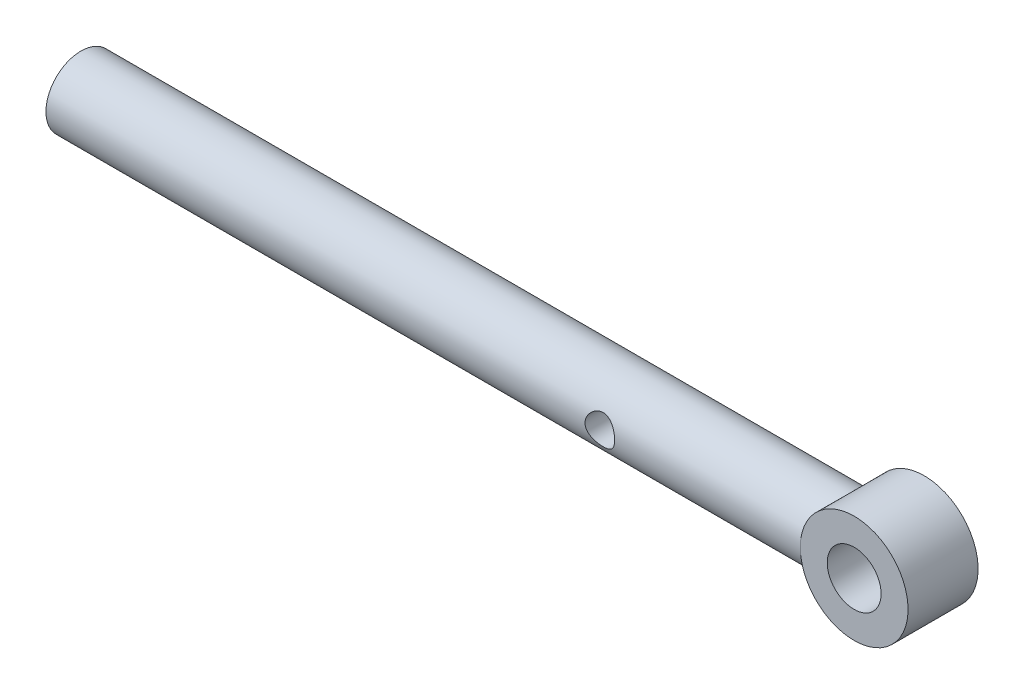
ISO-10303-21;
HEADER;
FILE_DESCRIPTION(('STEP AP214'),'2;1');
FILE_NAME('part.step','',(''),(''),'','','');
FILE_SCHEMA(('AUTOMOTIVE_DESIGN { 1 0 10303 214 1 1 1 1 }'));
ENDSEC;
DATA;
#1=APPLICATION_CONTEXT('core data for automotive mechanical design processes');
#2=APPLICATION_PROTOCOL_DEFINITION('international standard','automotive_design',2000,#1);
#3=PRODUCT_CONTEXT('',#1,'mechanical');
#4=PRODUCT('Part','Part','',(#3));
#5=PRODUCT_RELATED_PRODUCT_CATEGORY('part','',(#4));
#6=PRODUCT_DEFINITION_FORMATION('','',#4);
#7=PRODUCT_DEFINITION_CONTEXT('part definition',#1,'design');
#8=PRODUCT_DEFINITION('design','',#6,#7);
#9=PRODUCT_DEFINITION_SHAPE('','',#8);
#10=(LENGTH_UNIT() NAMED_UNIT(*) SI_UNIT(.MILLI.,.METRE.));
#11=(NAMED_UNIT(*) PLANE_ANGLE_UNIT() SI_UNIT($,.RADIAN.));
#12=(NAMED_UNIT(*) SI_UNIT($,.STERADIAN.) SOLID_ANGLE_UNIT());
#13=UNCERTAINTY_MEASURE_WITH_UNIT(LENGTH_MEASURE(1.E-05),#10,'distance_accuracy_value','');
#14=(GEOMETRIC_REPRESENTATION_CONTEXT(3) GLOBAL_UNCERTAINTY_ASSIGNED_CONTEXT((#13)) GLOBAL_UNIT_ASSIGNED_CONTEXT((#10,
#11,#12)) REPRESENTATION_CONTEXT('',''));
#15=CARTESIAN_POINT('',(0.,0.,0.));
#16=DIRECTION('',(0.,0.,1.));
#17=DIRECTION('',(1.,0.,0.));
#18=AXIS2_PLACEMENT_3D('',#15,#16,#17);
#19=CARTESIAN_POINT('',(400.,0.,0.));
#20=DIRECTION('',(-1.,0.,0.));
#21=DIRECTION('',(0.,0.,1.));
#22=AXIS2_PLACEMENT_3D('',#19,#20,#21);
#23=CYLINDRICAL_SURFACE('',#22,6.5);
#24=CARTESIAN_POINT('',(390.,0.,6.5));
#25=CARTESIAN_POINT('',(389.999993586303,0.164119280759625,6.50000685430514));
#26=CARTESIAN_POINT('',(390.004045520485,0.328181084996379,6.4937804695745));
#27=CARTESIAN_POINT('',(390.020136386316,0.655023622368724,6.46898576666347));
#28=CARTESIAN_POINT('',(390.032176420075,0.817804175595379,6.45041574544525));
#29=CARTESIAN_POINT('',(390.063961115275,1.14083286503593,6.40118886176247));
#30=CARTESIAN_POINT('',(390.083709637089,1.3010796904681,6.37052594315651));
#31=CARTESIAN_POINT('',(390.130444457707,1.61787591423726,6.29753224205717));
#32=CARTESIAN_POINT('',(390.157433744039,1.7744237573047,6.25519664323323));
#33=CARTESIAN_POINT('',(390.217878294193,2.0819505926509,6.15964840684597));
#34=CARTESIAN_POINT('',(390.251299158941,2.23295433687693,6.10649355213575));
#35=CARTESIAN_POINT('',(390.323987183279,2.52945044906857,5.98976622841122));
#36=CARTESIAN_POINT('',(390.363256609614,2.67494065258442,5.92618971927556));
#37=CARTESIAN_POINT('',(390.488656877421,3.10195683996531,5.72079421747863));
#38=CARTESIAN_POINT('',(390.582436912604,3.3743083610705,5.56422093465473));
#39=CARTESIAN_POINT('',(390.791870968579,3.91157881466344,5.20223393268196));
#40=CARTESIAN_POINT('',(390.908694067025,4.17400805136777,4.99384658437885));
#41=CARTESIAN_POINT('',(391.149380877012,4.66269524452488,4.5409672581674));
#42=CARTESIAN_POINT('',(391.273254216815,4.88890204474905,4.29642514021972));
#43=CARTESIAN_POINT('',(391.465785556549,5.21404599563559,3.88590184279141));
#44=CARTESIAN_POINT('',(391.535526475782,5.32620248723501,3.73072586384602));
#45=CARTESIAN_POINT('',(391.671864339755,5.53695896721197,3.41012305177937));
#46=CARTESIAN_POINT('',(391.738460619637,5.63555609715149,3.24469406786067));
#47=CARTESIAN_POINT('',(391.929899122721,5.90956057342641,2.73419500575102));
#48=CARTESIAN_POINT('',(392.046800532104,6.06383906030271,2.374087475581));
#49=CARTESIAN_POINT('',(392.211524280352,6.2731496367472,1.72601125957263));
#50=CARTESIAN_POINT('',(392.26951189369,6.3438356642515,1.4456937630005));
#51=CARTESIAN_POINT('',(392.334215655135,6.42158956394034,1.017013972848));
#52=CARTESIAN_POINT('',(392.35206838734,6.4427926430709,0.872802937709978));
#53=CARTESIAN_POINT('',(392.379733513579,6.47549388478877,0.582488505178464));
#54=CARTESIAN_POINT('',(392.389545834401,6.48699195900619,0.436385090566016));
#55=CARTESIAN_POINT('',(392.40073445225,6.50009494372617,0.142902464999761));
#56=CARTESIAN_POINT('',(392.402081285159,6.50166530093557,-0.00447941598654113));
#57=CARTESIAN_POINT('',(392.396208278458,6.4947957489201,-0.29883589784061));
#58=CARTESIAN_POINT('',(392.388988399504,6.48635579372349,-0.445810496834852));
#59=CARTESIAN_POINT('',(392.36627178076,6.45960526860128,-0.738289234379131));
#60=CARTESIAN_POINT('',(392.350770652135,6.44128946469984,-0.883792551488456));
#61=CARTESIAN_POINT('',(392.31210597535,6.39509034671605,-1.17226030901298));
#62=CARTESIAN_POINT('',(392.288939224748,6.36720303379248,-1.31522366196875));
#63=CARTESIAN_POINT('',(392.211037409616,6.272055345488,-1.72897319993804));
#64=CARTESIAN_POINT('',(392.146959537067,6.19227477492949,-1.9952401396177));
#65=CARTESIAN_POINT('',(392.000459116128,6.00180840466878,-2.51079310231954));
#66=CARTESIAN_POINT('',(391.91803052976,5.8911124297419,-2.76007350087987));
#67=CARTESIAN_POINT('',(391.724456061789,5.61682514095975,-3.28725600333686));
#68=CARTESIAN_POINT('',(391.610853347473,5.44710578330998,-3.56109463007118));
#69=CARTESIAN_POINT('',(391.436332954818,5.16487552221648,-3.94965314154834));
#70=CARTESIAN_POINT('',(391.377420991373,5.06609333754959,-4.07557146154997));
#71=CARTESIAN_POINT('',(391.259346392837,4.85953778211174,-4.31977527769707));
#72=CARTESIAN_POINT('',(391.200183713948,4.75176277317022,-4.43805937617027));
#73=CARTESIAN_POINT('',(391.071305779014,4.50569495437236,-4.68884870072512));
#74=CARTESIAN_POINT('',(391.001779735761,4.36554684166518,-4.81963616496473));
#75=CARTESIAN_POINT('',(390.865819953758,4.07341393466754,-5.06894012405979));
#76=CARTESIAN_POINT('',(390.799385235686,3.92143293035477,-5.187460519856));
#77=CARTESIAN_POINT('',(390.671345525783,3.6062613712715,-5.41130443437323));
#78=CARTESIAN_POINT('',(390.60973779071,3.44307728377902,-5.51663546945789));
#79=CARTESIAN_POINT('',(390.49298912148,3.10620281844421,-5.71309872843021));
#80=CARTESIAN_POINT('',(390.437846392059,2.93251537767645,-5.80423489640323));
#81=CARTESIAN_POINT('',(390.345738630376,2.61101594690159,-5.95462468514812));
#82=CARTESIAN_POINT('',(390.307336375307,2.46489156746619,-6.01661798038689));
#83=CARTESIAN_POINT('',(390.236473651877,2.16724311828888,-6.13012348624876));
#84=CARTESIAN_POINT('',(390.204012004735,2.01572012692652,-6.18163777642537));
#85=CARTESIAN_POINT('',(390.145734931948,1.70819643616229,-6.27357982287776));
#86=CARTESIAN_POINT('',(390.119915391148,1.55219857611178,-6.31401444464209));
#87=CARTESIAN_POINT('',(390.07547892055,1.23663514621913,-6.38332411385598));
#88=CARTESIAN_POINT('',(390.056862116429,1.07706951417547,-6.41219895960303));
#89=CARTESIAN_POINT('',(390.027219276303,0.754920216694231,-6.45806964601368));
#90=CARTESIAN_POINT('',(390.016221941804,0.592327483573628,-6.47502057452623));
#91=CARTESIAN_POINT('',(390.002203877963,0.265980899138394,-6.49661412277271));
#92=CARTESIAN_POINT('',(389.999183153385,0.102227047130525,-6.50125673515741));
#93=CARTESIAN_POINT('',(390.00119440123,-0.225117414059149,-6.49816240409039));
#94=CARTESIAN_POINT('',(390.006226593397,-0.388708018664465,-6.49042512282323));
#95=CARTESIAN_POINT('',(390.024217731166,-0.71439946734237,-6.46268855205708));
#96=CARTESIAN_POINT('',(390.037176425776,-0.876500358421799,-6.44268965082245));
#97=CARTESIAN_POINT('',(390.069698616811,-1.18836560805063,-6.39227907727336));
#98=CARTESIAN_POINT('',(390.08882185833,-1.33828891995518,-6.36255995200507));
#99=CARTESIAN_POINT('',(390.1333982873,-1.63482796932093,-6.2928964193549));
#100=CARTESIAN_POINT('',(390.158853637261,-1.78144255810638,-6.25294851855328));
#101=CARTESIAN_POINT('',(390.215578079947,-2.07044913123637,-6.1632880457657));
#102=CARTESIAN_POINT('',(390.246845441632,-2.21284235826129,-6.1135783809603));
#103=CARTESIAN_POINT('',(390.314607918359,-2.4927824201715,-6.00488255543653));
#104=CARTESIAN_POINT('',(390.351105035775,-2.63032737349666,-5.9458928407148));
#105=CARTESIAN_POINT('',(390.472860848262,-3.05341719432729,-5.74699552823235));
#106=CARTESIAN_POINT('',(390.566373551271,-3.32939733222981,-5.59135302264547));
#107=CARTESIAN_POINT('',(390.767556588114,-3.85237378309446,-5.24479777042459));
#108=CARTESIAN_POINT('',(390.87523712834,-4.09934895603141,-5.05385955651283));
#109=CARTESIAN_POINT('',(391.114759988587,-4.59785457689378,-4.60848915376557));
#110=CARTESIAN_POINT('',(391.247758140423,-4.84414021592673,-4.34880166753223));
#111=CARTESIAN_POINT('',(391.510910124238,-5.29176033397404,-3.79143911565763));
#112=CARTESIAN_POINT('',(391.641062779017,-5.49307651484261,-3.49374866369196));
#113=CARTESIAN_POINT('',(391.815992276672,-5.74725953582768,-3.04043808415799));
#114=CARTESIAN_POINT('',(391.867803100293,-5.82017548427428,-2.89848942966346));
#115=CARTESIAN_POINT('',(391.966694080786,-5.95592398078338,-2.608186644678));
#116=CARTESIAN_POINT('',(392.013773842421,-6.01875568665982,-2.4598319805005));
#117=CARTESIAN_POINT('',(392.101666949533,-6.13364238156604,-2.1574422412898));
#118=CARTESIAN_POINT('',(392.142488639235,-6.18571175345317,-2.0034150758395));
#119=CARTESIAN_POINT('',(392.216439321873,-6.27851166712416,-1.69024632562597));
#120=CARTESIAN_POINT('',(392.249572820715,-6.31924885328931,-1.53110779911877));
#121=CARTESIAN_POINT('',(392.302480158807,-6.38354528657849,-1.2328809318009));
#122=CARTESIAN_POINT('',(392.323513371656,-6.40876598411912,-1.09437322953979));
#123=CARTESIAN_POINT('',(392.358315874343,-6.45022483002795,-0.81516997564765));
#124=CARTESIAN_POINT('',(392.372088643945,-6.46646728164563,-0.67447550543243));
#125=CARTESIAN_POINT('',(392.391867370508,-6.48972674547164,-0.391843554437836));
#126=CARTESIAN_POINT('',(392.397876945547,-6.49674805526795,-0.249906683761441));
#127=CARTESIAN_POINT('',(392.401908827972,-6.50146287851289,0.0342390668089815));
#128=CARTESIAN_POINT('',(392.399930963836,-6.49915619165132,0.176447952478736));
#129=CARTESIAN_POINT('',(392.388066442387,-6.48525665923298,0.459966172648716));
#130=CARTESIAN_POINT('',(392.378186071304,-6.47367119467953,0.601276132198632));
#131=CARTESIAN_POINT('',(392.35091408855,-6.44142145223632,0.882092305243088));
#132=CARTESIAN_POINT('',(392.333522547679,-6.42075725991967,1.02159853572622));
#133=CARTESIAN_POINT('',(392.270923107682,-6.3455303165674,1.43635898086942));
#134=CARTESIAN_POINT('',(392.215296183533,-6.27773937798605,1.70773598463728));
#135=CARTESIAN_POINT('',(392.063607932352,-6.08543164257966,2.31204469034431));
#136=CARTESIAN_POINT('',(391.960476964707,-5.950118556342,2.63974081629942));
#137=CARTESIAN_POINT('',(391.791171982336,-5.71180426164701,3.10742020806168));
#138=CARTESIAN_POINT('',(391.732230724186,-5.62636405129017,3.25948701264254));
#139=CARTESIAN_POINT('',(391.611152365587,-5.4441875659777,3.55541481306506));
#140=CARTESIAN_POINT('',(391.549015457305,-5.34745196981808,3.69927630123248));
#141=CARTESIAN_POINT('',(391.42220012781,-5.14161400454046,3.98053506777858));
#142=CARTESIAN_POINT('',(391.357497235589,-5.03234310051467,4.11779748244813));
#143=CARTESIAN_POINT('',(391.228021283268,-4.80309459910701,4.38303572714264));
#144=CARTESIAN_POINT('',(391.163248224167,-4.68311715209149,4.51101168754397));
#145=CARTESIAN_POINT('',(391.035065911665,-4.43280191261125,4.75721465878498));
#146=CARTESIAN_POINT('',(390.971656972952,-4.30246176146269,4.87543943758301));
#147=CARTESIAN_POINT('',(390.84759012389,-4.03181828402221,5.10152283175588));
#148=CARTESIAN_POINT('',(390.786932574608,-3.89151365624477,5.20938008865666));
#149=CARTESIAN_POINT('',(390.663779131213,-3.58673155632102,5.42434779160764));
#150=CARTESIAN_POINT('',(390.601716759455,-3.42124404572524,5.53028163288415));
#151=CARTESIAN_POINT('',(390.484301383603,-3.07962438275018,5.72754718477757));
#152=CARTESIAN_POINT('',(390.428945130593,-2.90349744734073,5.81888597316296));
#153=CARTESIAN_POINT('',(390.326626018032,-2.54186372868408,5.98569118222311));
#154=CARTESIAN_POINT('',(390.279650260973,-2.35637193238802,6.06118202495428));
#155=CARTESIAN_POINT('',(390.195515550102,-1.97731586036628,6.19521018933234));
#156=CARTESIAN_POINT('',(390.158351850165,-1.78375554006782,6.25375570881159));
#157=CARTESIAN_POINT('',(390.085416453992,-1.32991995952219,6.36800512985459));
#158=CARTESIAN_POINT('',(390.053556212112,-1.06736624141744,6.41734848998334));
#159=CARTESIAN_POINT('',(390.010856332062,-0.536489377226047,6.48333549186061));
#160=CARTESIAN_POINT('',(390.000010479865,-0.268167960404361,6.49998880018837));
#161=CARTESIAN_POINT('',(390.,0.,6.5));
#162=B_SPLINE_CURVE_WITH_KNOTS('',3,(#24,#25,#26,#27,#28,#29,#30,#31,#32,#33,#34,#35,#36,#37,
#38,#39,#40,#41,#42,#43,#44,#45,#46,#47,#48,#49,#50,#51,#52,#53,#54,#55,#56,#57,#58,#59,#60,#61,
#62,#63,#64,#65,#66,#67,#68,#69,#70,#71,#72,#73,#74,#75,#76,#77,#78,#79,#80,#81,#82,#83,#84,#85,
#86,#87,#88,#89,#90,#91,#92,#93,#94,#95,#96,#97,#98,#99,#100,#101,#102,#103,#104,#105,#106,#107,
#108,#109,#110,#111,#112,#113,#114,#115,#116,#117,#118,#119,#120,#121,#122,#123,#124,#125,#126,
#127,#128,#129,#130,#131,#132,#133,#134,#135,#136,#137,#138,#139,#140,#141,#142,#143,#144,#145,
#146,#147,#148,#149,#150,#151,#152,#153,#154,#155,#156,#157,#158,#159,#160,#161),.UNSPECIFIED.,
.T.,.F.,(4,2,2,2,2,2,2,2,2,2,2,2,2,2,2,2,2,2,2,2,2,2,2,2,2,2,2,2,2,2,2,2,2,2,2,2,2,2,2,2,2,2,2,
2,2,2,2,2,2,2,2,2,2,2,2,2,2,2,2,2,2,2,2,2,2,2,2,2,4),(0.,0.492091986044231,0.984251879570153,
1.47665856114152,1.96926872225814,2.45931393740373,2.94954957766666,3.92913357208854,
4.98995902879469,6.05226970078238,6.66290796337445,7.27367475743858,8.49185463476724,
9.37257039082095,9.81263469366266,10.2527030035107,10.6943021261393,11.1359032767928,
11.577738696408,12.0197589337679,12.8720417021512,13.7246053146532,14.7454619588666,
15.2567705800062,15.7681725474667,16.3791876902081,16.9900079286156,17.6004784725631,
18.2107790917254,18.7002159053075,19.1895554954293,19.6785911782732,20.167635393759,
20.6585119008773,21.1493887010952,21.6402788963066,22.1311535482759,22.5927372982543,
23.0544789030601,23.5160832031736,23.977864717312,24.964766853407,25.9523838785814,
27.0933185991326,28.2347167256187,28.7376775389197,29.2406803351868,29.7430065055697,
30.245037524109,30.6716272338596,31.0980123026105,31.5241985805355,31.9503940104696,
32.37625075041,32.8021034764517,33.6541622645164,34.7556438352601,35.3075769135321,
35.8594768404502,36.4199365575092,36.9803884045195,37.5409681847565,38.1016213188722,
38.7189234293369,39.3359252689625,39.9519691991644,40.5677145987077,41.3720219483566,
42.1760914252518),.UNSPECIFIED.);
#163=CARTESIAN_POINT('',(390.,0.,-6.5));
#164=VERTEX_POINT('',#163);
#165=CARTESIAN_POINT('',(390.,0.,6.5));
#166=VERTEX_POINT('',#165);
#167=EDGE_CURVE('E47',#164,#166,#162,.T.);
#168=ORIENTED_EDGE('',*,*,#167,.T.);
#169=EDGE_CURVE('E11',#166,#164,#162,.T.);
#170=ORIENTED_EDGE('',*,*,#169,.T.);
#171=EDGE_LOOP('',(#168,#170));
#172=FACE_BOUND('',#171,.T.);
#173=CARTESIAN_POINT('',(250.,0.,0.));
#174=DIRECTION('',(1.,0.,0.));
#175=DIRECTION('',(0.,0.,-1.));
#176=AXIS2_PLACEMENT_3D('',#173,#174,#175);
#177=CIRCLE('',#176,6.5);
#178=CARTESIAN_POINT('',(250.,0.,-6.5));
#179=VERTEX_POINT('',#178);
#180=EDGE_CURVE('E131',#179,#179,#177,.T.);
#181=ORIENTED_EDGE('',*,*,#180,.T.);
#182=EDGE_LOOP('',(#181));
#183=FACE_BOUND('',#182,.T.);
#184=CARTESIAN_POINT('',(355.55,-3.29595838386792E-13,-6.5));
#185=CARTESIAN_POINT('',(355.549993641744,-0.147095604976514,-6.49999498130397));
#186=CARTESIAN_POINT('',(355.538128061565,-0.294443653510951,-6.49495005622004));
#187=CARTESIAN_POINT('',(355.491115681638,-0.584938393710041,-6.4752730607783));
#188=CARTESIAN_POINT('',(355.455909175164,-0.728073324840635,-6.46061640439326));
#189=CARTESIAN_POINT('',(355.363744887904,-1.00548133884131,-6.42328007385424));
#190=CARTESIAN_POINT('',(355.306861717665,-1.13978298673877,-6.40062793944866));
#191=CARTESIAN_POINT('',(355.173274744181,-1.39680292809858,-6.34949880042434));
#192=CARTESIAN_POINT('',(355.096576603999,-1.51952451745091,-6.3210234605455));
#193=CARTESIAN_POINT('',(354.921373007029,-1.75641304507581,-6.25944811695529));
#194=CARTESIAN_POINT('',(354.822011885791,-1.86990662074951,-6.22619363648696));
#195=CARTESIAN_POINT('',(354.606113684105,-2.07920146057456,-6.15946522315813));
#196=CARTESIAN_POINT('',(354.489567359636,-2.17499313989334,-6.12599118151209));
#197=CARTESIAN_POINT('',(354.235393622526,-2.35100695979311,-6.06069608143991));
#198=CARTESIAN_POINT('',(354.09699335735,-2.43018354211554,-6.02904686272196));
#199=CARTESIAN_POINT('',(353.807308432845,-2.56383220617946,-5.97344482313793));
#200=CARTESIAN_POINT('',(353.656030664354,-2.61831740295669,-5.94948791841071));
#201=CARTESIAN_POINT('',(353.352636794741,-2.69823406232846,-5.91366019374601));
#202=CARTESIAN_POINT('',(353.200928543661,-2.72496370479431,-5.90125247275764));
#203=CARTESIAN_POINT('',(352.894711996509,-2.75265808661863,-5.88838956935421));
#204=CARTESIAN_POINT('',(352.74020536567,-2.75363767562838,-5.88792749807316));
#205=CARTESIAN_POINT('',(352.445897604077,-2.73077968681024,-5.89855515738237));
#206=CARTESIAN_POINT('',(352.305903928741,-2.70890893787309,-5.90872941435648));
#207=CARTESIAN_POINT('',(352.031800427239,-2.64427793630321,-5.93793215271634));
#208=CARTESIAN_POINT('',(351.8976917753,-2.60151353526638,-5.95696239240884));
#209=CARTESIAN_POINT('',(351.635724810774,-2.49547013896617,-6.00216625429438));
#210=CARTESIAN_POINT('',(351.508063868371,-2.43176830134788,-6.02848518619335));
#211=CARTESIAN_POINT('',(351.264736782205,-2.2859582541387,-6.08526964618989));
#212=CARTESIAN_POINT('',(351.149075476595,-2.20384266213501,-6.11573683547031));
#213=CARTESIAN_POINT('',(350.922392166834,-2.0151158293409,-6.18062261649006));
#214=CARTESIAN_POINT('',(350.812658876485,-1.9069910403644,-6.21515384418764));
#215=CARTESIAN_POINT('',(350.612442284652,-1.67354239576029,-6.28203705254945));
#216=CARTESIAN_POINT('',(350.521963773882,-1.54821427256223,-6.31438848950263));
#217=CARTESIAN_POINT('',(350.3608546946,-1.27989673380649,-6.37425989291266));
#218=CARTESIAN_POINT('',(350.290763899645,-1.13655022963936,-6.40164228363614));
#219=CARTESIAN_POINT('',(350.176147276182,-0.838645751414202,-6.4474277569293));
#220=CARTESIAN_POINT('',(350.131606869033,-0.68409422758151,-6.46583595912425));
#221=CARTESIAN_POINT('',(350.072088691708,-0.378923135883743,-6.49063337478788));
#222=CARTESIAN_POINT('',(350.05538240739,-0.228697665608617,-6.49772407425565));
#223=CARTESIAN_POINT('',(350.046834137484,0.0725660206675551,-6.50133831208649));
#224=CARTESIAN_POINT('',(350.054984729384,0.223603980605646,-6.49786500496898));
#225=CARTESIAN_POINT('',(350.094695353345,0.514007500768413,-6.48119445769427));
#226=CARTESIAN_POINT('',(350.125027941554,0.653573560643801,-6.46850731206417));
#227=CARTESIAN_POINT('',(350.206518099307,0.925474533207279,-6.43523660675563));
#228=CARTESIAN_POINT('',(350.257678279192,1.05780853713612,-6.41465205730678));
#229=CARTESIAN_POINT('',(350.381038063119,1.31615106706206,-6.36675369008725));
#230=CARTESIAN_POINT('',(350.453843777903,1.44183384199426,-6.33925011498224));
#231=CARTESIAN_POINT('',(350.617763795689,1.67965010769158,-6.2804304662636));
#232=CARTESIAN_POINT('',(350.70888584033,1.79177783703765,-6.24911278277997));
#233=CARTESIAN_POINT('',(350.914687874576,2.00797814082534,-6.18318062494549));
#234=CARTESIAN_POINT('',(351.030607841417,2.11085114942685,-6.148493116821));
#235=CARTESIAN_POINT('',(351.278593041759,2.29603450541656,-6.08177093803803));
#236=CARTESIAN_POINT('',(351.410662361309,2.3783396326981,-6.0497369422145));
#237=CARTESIAN_POINT('',(351.690233937303,2.52109773062089,-5.99167144341993));
#238=CARTESIAN_POINT('',(351.837951434497,2.58117534355242,-5.96574551680103));
#239=CARTESIAN_POINT('',(352.142851590819,2.67507819279778,-5.92424181181642));
#240=CARTESIAN_POINT('',(352.300025992151,2.70892598460518,-5.90865514420136));
#241=CARTESIAN_POINT('',(352.606025758415,2.74713433457505,-5.89098085162699));
#242=CARTESIAN_POINT('',(352.754532249557,2.75360950579122,-5.88792574029151));
#243=CARTESIAN_POINT('',(353.050436086816,2.74256989307983,-5.89307642483326));
#244=CARTESIAN_POINT('',(353.197833612297,2.72505907629248,-5.90128035853162));
#245=CARTESIAN_POINT('',(353.47980695181,2.66833888042902,-5.92712885418347));
#246=CARTESIAN_POINT('',(353.614656326191,2.63024587045229,-5.94428627271309));
#247=CARTESIAN_POINT('',(353.876070882872,2.53455331521082,-5.98571160526769));
#248=CARTESIAN_POINT('',(354.002633710496,2.47694825393177,-6.00998152972073));
#249=CARTESIAN_POINT('',(354.252335189327,2.33981537805408,-6.06473606756697));
#250=CARTESIAN_POINT('',(354.374791333747,2.25916250184288,-6.0955099319246));
#251=CARTESIAN_POINT('',(354.605092478966,2.07977578136725,-6.15902451746635));
#252=CARTESIAN_POINT('',(354.712932139928,1.98103535999568,-6.19176595119091));
#253=CARTESIAN_POINT('',(354.919387451112,1.75935485658682,-6.25851710771622));
#254=CARTESIAN_POINT('',(355.016677487086,1.63514531293944,-6.29243385868539));
#255=CARTESIAN_POINT('',(355.189115924484,1.37095965290541,-6.35522730655302));
#256=CARTESIAN_POINT('',(355.264254274306,1.23097641871019,-6.38410171301006));
#257=CARTESIAN_POINT('',(355.388710852559,0.941016140694286,-6.43317009585139));
#258=CARTESIAN_POINT('',(355.438411869254,0.791228015437362,-6.45349189007697));
#259=CARTESIAN_POINT('',(355.493226059786,0.561472417957089,-6.47616523982253));
#260=CARTESIAN_POINT('',(355.508203516867,0.484109760486643,-6.48241945176029));
#261=CARTESIAN_POINT('',(355.531474994328,0.328231127697464,-6.49217504347531));
#262=CARTESIAN_POINT('',(355.539773860701,0.249716030788824,-6.49567841921755));
#263=CARTESIAN_POINT('',(355.546452323042,0.142527125168482,-6.49849973709677));
#264=CARTESIAN_POINT('',(355.547782035837,0.114041599838836,-6.49906179883716));
#265=CARTESIAN_POINT('',(355.549556492839,0.0570405475275542,-6.49981241775866));
#266=CARTESIAN_POINT('',(355.550001233004,0.0285250204094789,-6.50000097323375));
#267=CARTESIAN_POINT('',(355.55,-3.29595838386792E-13,-6.5));
#268=B_SPLINE_CURVE_WITH_KNOTS('',3,(#184,#185,#186,#187,#188,#189,#190,#191,#192,#193,#194,
#195,#196,#197,#198,#199,#200,#201,#202,#203,#204,#205,#206,#207,#208,#209,#210,#211,#212,#213,
#214,#215,#216,#217,#218,#219,#220,#221,#222,#223,#224,#225,#226,#227,#228,#229,#230,#231,#232,
#233,#234,#235,#236,#237,#238,#239,#240,#241,#242,#243,#244,#245,#246,#247,#248,#249,#250,#251,
#252,#253,#254,#255,#256,#257,#258,#259,#260,#261,#262,#263,#264,#265,#266,#267),.UNSPECIFIED.,
.T.,.F.,(4,2,2,2,2,2,2,2,2,2,2,2,2,2,2,2,2,2,2,2,2,2,2,2,2,2,2,2,2,2,2,2,2,2,2,2,2,2,2,2,2,4),
(0.,0.441174809048316,0.883482532284351,1.3242813965454,1.76495442080472,2.2263435078441,
2.68798169033373,3.17320635520402,3.65817298598607,4.11926646042799,4.58009402367006,
5.00428476089462,5.42855975481783,5.86199179941088,6.29559792655465,6.76709651733294,
7.23871228319263,7.72186688611207,8.20474553388172,8.65633603591698,9.10779170169306,
9.53599292734193,9.96424783638273,10.4058518715491,10.8476429504631,11.3219375297119,
11.7963523624504,12.2784479286589,12.7601284707967,13.2038287551318,13.6474556629305,
14.069134694059,14.4909330325585,14.9385211967918,15.3862724400997,15.8680826168138,
16.3501110855492,16.8246552178546,17.0615237476885,17.2982202500836,17.3837732001806,
17.4693265410465),.UNSPECIFIED.);
#269=CARTESIAN_POINT('',(355.55,-3.29595838386792E-13,-6.5));
#270=VERTEX_POINT('',#269);
#271=EDGE_CURVE('E168',#270,#270,#268,.T.);
#272=ORIENTED_EDGE('',*,*,#271,.F.);
#273=EDGE_LOOP('',(#272));
#274=FACE_BOUND('',#273,.T.);
#275=CARTESIAN_POINT('',(350.05,-3.29595838386792E-13,6.5));
#276=CARTESIAN_POINT('',(350.050006358256,0.147095604975855,6.49999498130398));
#277=CARTESIAN_POINT('',(350.061871938436,0.294443653510292,6.49495005622006));
#278=CARTESIAN_POINT('',(350.108884318362,0.584938393709378,6.47527306077836));
#279=CARTESIAN_POINT('',(350.144090824836,0.728073324839967,6.46061640439334));
#280=CARTESIAN_POINT('',(350.236255112096,1.00548133884064,6.42328007385435));
#281=CARTESIAN_POINT('',(350.293138282335,1.1397829867381,6.40062793944878));
#282=CARTESIAN_POINT('',(350.426725255819,1.39680292809792,6.34949880042449));
#283=CARTESIAN_POINT('',(350.503423396001,1.51952451745024,6.32102346054566));
#284=CARTESIAN_POINT('',(350.678626992971,1.75641304507515,6.25944811695548));
#285=CARTESIAN_POINT('',(350.777988114209,1.86990662074885,6.22619363648716));
#286=CARTESIAN_POINT('',(350.993886315895,2.0792014605739,6.15946522315836));
#287=CARTESIAN_POINT('',(351.110432640364,2.17499313989267,6.12599118151233));
#288=CARTESIAN_POINT('',(351.364606377474,2.35100695979245,6.06069608144017));
#289=CARTESIAN_POINT('',(351.50300664265,2.43018354211488,6.02904686272223));
#290=CARTESIAN_POINT('',(351.792691567155,2.56383220617878,5.97344482313822));
#291=CARTESIAN_POINT('',(351.943969335646,2.61831740295601,5.94948791841101));
#292=CARTESIAN_POINT('',(352.247363205259,2.69823406232778,5.91366019374632));
#293=CARTESIAN_POINT('',(352.399071456339,2.72496370479364,5.90125247275795));
#294=CARTESIAN_POINT('',(352.705288003491,2.75265808661797,5.88838956935452));
#295=CARTESIAN_POINT('',(352.85979463433,2.75363767562772,5.88792749807347));
#296=CARTESIAN_POINT('',(353.154102395923,2.73077968680958,5.89855515738267));
#297=CARTESIAN_POINT('',(353.294096071259,2.70890893787244,5.90872941435678));
#298=CARTESIAN_POINT('',(353.568199572761,2.64427793630256,5.93793215271662));
#299=CARTESIAN_POINT('',(353.7023082247,2.60151353526573,5.95696239240913));
#300=CARTESIAN_POINT('',(353.964275189227,2.49547013896551,6.00216625429466));
#301=CARTESIAN_POINT('',(354.091936131629,2.43176830134722,6.02848518619361));
#302=CARTESIAN_POINT('',(354.335263217795,2.28595825413804,6.08526964619014));
#303=CARTESIAN_POINT('',(354.450924523405,2.20384266213435,6.11573683547055));
#304=CARTESIAN_POINT('',(354.677607833166,2.01511582934023,6.18062261649028));
#305=CARTESIAN_POINT('',(354.787341123515,1.90699104036373,6.21515384418785));
#306=CARTESIAN_POINT('',(354.987557715348,1.6735423957596,6.28203705254963));
#307=CARTESIAN_POINT('',(355.078036226118,1.54821427256153,6.3143884895028));
#308=CARTESIAN_POINT('',(355.2391453054,1.27989673380578,6.3742598929128));
#309=CARTESIAN_POINT('',(355.309236100355,1.13655022963867,6.40164228363626));
#310=CARTESIAN_POINT('',(355.423852723818,0.838645751413521,6.44742775692938));
#311=CARTESIAN_POINT('',(355.468393130967,0.684094227580824,6.46583595912432));
#312=CARTESIAN_POINT('',(355.527911308292,0.378923135883062,6.49063337478792));
#313=CARTESIAN_POINT('',(355.544617592611,0.228697665607944,6.49772407425568));
#314=CARTESIAN_POINT('',(355.553165862516,-0.0725660206682148,6.50133831208649));
#315=CARTESIAN_POINT('',(355.545015270616,-0.2236039806063,6.49786500496896));
#316=CARTESIAN_POINT('',(355.505304646655,-0.514007500769062,6.48119445769422));
#317=CARTESIAN_POINT('',(355.474972058446,-0.65357356064445,6.46850731206411));
#318=CARTESIAN_POINT('',(355.393481900694,-0.925474533207921,6.43523660675553));
#319=CARTESIAN_POINT('',(355.342321720808,-1.05780853713675,6.41465205730667));
#320=CARTESIAN_POINT('',(355.218961936881,-1.3161510670627,6.36675369008711));
#321=CARTESIAN_POINT('',(355.146156222097,-1.44183384199491,6.3392501149821));
#322=CARTESIAN_POINT('',(354.982236204311,-1.67965010769222,6.28043046626343));
#323=CARTESIAN_POINT('',(354.89111415967,-1.79177783703828,6.2491127827798));
#324=CARTESIAN_POINT('',(354.685312125424,-2.00797814082596,6.18318062494529));
#325=CARTESIAN_POINT('',(354.569392158583,-2.11085114942748,6.14849311682079));
#326=CARTESIAN_POINT('',(354.321406958241,-2.29603450541721,6.08177093803779));
#327=CARTESIAN_POINT('',(354.189337638691,-2.37833963269875,6.04973694221424));
#328=CARTESIAN_POINT('',(353.909766062697,-2.52109773062155,5.99167144341966));
#329=CARTESIAN_POINT('',(353.762048565503,-2.58117534355308,5.96574551680075));
#330=CARTESIAN_POINT('',(353.457148409181,-2.67507819279844,5.92424181181612));
#331=CARTESIAN_POINT('',(353.299974007849,-2.70892598460584,5.90865514420106));
#332=CARTESIAN_POINT('',(352.993974241585,-2.74713433457571,5.89098085162668));
#333=CARTESIAN_POINT('',(352.845467750443,-2.75360950579188,5.8879257402912));
#334=CARTESIAN_POINT('',(352.549563913184,-2.74256989308049,5.89307642483296));
#335=CARTESIAN_POINT('',(352.402166387704,-2.72505907629314,5.90128035853131));
#336=CARTESIAN_POINT('',(352.12019304819,-2.66833888042968,5.92712885418318));
#337=CARTESIAN_POINT('',(351.985343673809,-2.63024587045296,5.94428627271279));
#338=CARTESIAN_POINT('',(351.723929117129,-2.53455331521151,5.9857116052674));
#339=CARTESIAN_POINT('',(351.597366289504,-2.47694825393246,6.00998152972045));
#340=CARTESIAN_POINT('',(351.347664810673,-2.33981537805478,6.0647360675667));
#341=CARTESIAN_POINT('',(351.225208666253,-2.25916250184358,6.09550993192434));
#342=CARTESIAN_POINT('',(350.994907521034,-2.07977578136795,6.15902451746611));
#343=CARTESIAN_POINT('',(350.887067860072,-1.9810353599964,6.19176595119068));
#344=CARTESIAN_POINT('',(350.680612548889,-1.75935485658755,6.25851710771601));
#345=CARTESIAN_POINT('',(350.583322512914,-1.63514531294017,6.2924338586852));
#346=CARTESIAN_POINT('',(350.410884075516,-1.37095965290616,6.35522730655286));
#347=CARTESIAN_POINT('',(350.335745725694,-1.23097641871095,6.38410171300992));
#348=CARTESIAN_POINT('',(350.211289147441,-0.941016140695044,6.43317009585128));
#349=CARTESIAN_POINT('',(350.161588130746,-0.79122801543809,6.45349189007688));
#350=CARTESIAN_POINT('',(350.106773940214,-0.561472417957808,6.47616523982246));
#351=CARTESIAN_POINT('',(350.091796483133,-0.484109760487365,6.48241945176023));
#352=CARTESIAN_POINT('',(350.068525005672,-0.328231127698178,6.49217504347527));
#353=CARTESIAN_POINT('',(350.060226139299,-0.249716030789528,6.49567841921753));
#354=CARTESIAN_POINT('',(350.053547676958,-0.14252712516917,6.49849973709675));
#355=CARTESIAN_POINT('',(350.052217964163,-0.114041599839517,6.49906179883715));
#356=CARTESIAN_POINT('',(350.050443507161,-0.0570405475282241,6.49981241775866));
#357=CARTESIAN_POINT('',(350.049998766997,-0.0285250204101435,6.50000097323375));
#358=CARTESIAN_POINT('',(350.05,-3.29595838386792E-13,6.5));
#359=B_SPLINE_CURVE_WITH_KNOTS('',3,(#275,#276,#277,#278,#279,#280,#281,#282,#283,#284,#285,
#286,#287,#288,#289,#290,#291,#292,#293,#294,#295,#296,#297,#298,#299,#300,#301,#302,#303,#304,
#305,#306,#307,#308,#309,#310,#311,#312,#313,#314,#315,#316,#317,#318,#319,#320,#321,#322,#323,
#324,#325,#326,#327,#328,#329,#330,#331,#332,#333,#334,#335,#336,#337,#338,#339,#340,#341,#342,
#343,#344,#345,#346,#347,#348,#349,#350,#351,#352,#353,#354,#355,#356,#357,#358),.UNSPECIFIED.,
.T.,.F.,(4,2,2,2,2,2,2,2,2,2,2,2,2,2,2,2,2,2,2,2,2,2,2,2,2,2,2,2,2,2,2,2,2,2,2,2,2,2,2,2,2,4),
(0.,0.441174809048315,0.883482532284333,1.32428139654538,1.76495442080469,2.22634350784407,
2.68798169033369,3.17320635520398,3.65817298598591,4.11926646042783,4.58009402366996,
5.00428476089451,5.42855975481777,5.86199179941082,6.29559792655459,6.76709651733288,
7.23871228319258,7.72186688611203,8.20474553388165,8.6563360359169,9.10779170169296,
9.53599292734183,9.96424783638263,10.405851871549,10.8476429504631,11.3219375297117,
11.7963523624503,12.2784479286588,12.7601284707966,13.2038287551318,13.6474556629304,
14.0691346940588,14.4909330325584,14.9385211967917,15.3862724400996,15.8680826168137,
16.3501110855491,16.8246552178546,17.0615237476884,17.2982202500836,17.3837732001806,
17.4693265410465),.UNSPECIFIED.);
#360=CARTESIAN_POINT('',(350.05,-3.29595838386792E-13,6.5));
#361=VERTEX_POINT('',#360);
#362=EDGE_CURVE('E171',#361,#361,#359,.T.);
#363=ORIENTED_EDGE('',*,*,#362,.T.);
#364=EDGE_LOOP('',(#363));
#365=FACE_BOUND('',#364,.T.);
#366=ADVANCED_FACE('F38',(#172,#183,#274,#365),#23,.T.);
#367=CARTESIAN_POINT('',(400.,0.,-6.5));
#368=DIRECTION('',(0.,0.,1.));
#369=DIRECTION('',(1.,0.,0.));
#370=AXIS2_PLACEMENT_3D('',#367,#368,#369);
#371=CYLINDRICAL_SURFACE('',#370,9.99999999999998);
#372=ORIENTED_EDGE('',*,*,#169,.F.);
#373=CARTESIAN_POINT('',(400.,0.,6.5));
#374=DIRECTION('',(0.,0.,1.));
#375=DIRECTION('',(1.,0.,0.));
#376=AXIS2_PLACEMENT_3D('',#373,#374,#375);
#377=CIRCLE('',#376,9.99999999999998);
#378=EDGE_CURVE('E62',#166,#166,#377,.T.);
#379=ORIENTED_EDGE('',*,*,#378,.F.);
#380=ORIENTED_EDGE('',*,*,#167,.F.);
#381=CARTESIAN_POINT('',(400.,0.,-6.5));
#382=DIRECTION('',(0.,0.,1.));
#383=DIRECTION('',(1.,0.,0.));
#384=AXIS2_PLACEMENT_3D('',#381,#382,#383);
#385=CIRCLE('',#384,9.99999999999998);
#386=EDGE_CURVE('E128',#164,#164,#385,.T.);
#387=ORIENTED_EDGE('',*,*,#386,.T.);
#388=EDGE_LOOP('',(#372,#379,#380,#387));
#389=FACE_BOUND('',#388,.T.);
#390=ADVANCED_FACE('F138',(#389),#371,.T.);
#391=CARTESIAN_POINT('',(400.,0.,-6.5));
#392=DIRECTION('',(0.,0.,1.));
#393=DIRECTION('',(1.,0.,0.));
#394=AXIS2_PLACEMENT_3D('',#391,#392,#393);
#395=PLANE('',#394);
#396=CARTESIAN_POINT('',(400.,0.,-6.5));
#397=DIRECTION('',(0.,0.,1.));
#398=DIRECTION('',(1.,0.,0.));
#399=AXIS2_PLACEMENT_3D('',#396,#397,#398);
#400=CIRCLE('',#399,4.99999999999999);
#401=CARTESIAN_POINT('',(405.,0.,-6.5));
#402=VERTEX_POINT('',#401);
#403=EDGE_CURVE('E112',#402,#402,#400,.T.);
#404=ORIENTED_EDGE('',*,*,#403,.T.);
#405=EDGE_LOOP('',(#404));
#406=FACE_BOUND('',#405,.T.);
#407=ORIENTED_EDGE('',*,*,#386,.F.);
#408=EDGE_LOOP('',(#407));
#409=FACE_BOUND('',#408,.T.);
#410=ADVANCED_FACE('F142',(#406,#409),#395,.F.);
#411=CARTESIAN_POINT('',(400.,0.,6.5));
#412=DIRECTION('',(0.,0.,1.));
#413=DIRECTION('',(1.,0.,0.));
#414=AXIS2_PLACEMENT_3D('',#411,#412,#413);
#415=PLANE('',#414);
#416=CARTESIAN_POINT('',(400.,0.,6.5));
#417=DIRECTION('',(0.,0.,1.));
#418=DIRECTION('',(1.,0.,0.));
#419=AXIS2_PLACEMENT_3D('',#416,#417,#418);
#420=CIRCLE('',#419,4.99999999999999);
#421=CARTESIAN_POINT('',(405.,0.,6.5));
#422=VERTEX_POINT('',#421);
#423=EDGE_CURVE('E42',#422,#422,#420,.T.);
#424=ORIENTED_EDGE('',*,*,#423,.F.);
#425=EDGE_LOOP('',(#424));
#426=FACE_BOUND('',#425,.T.);
#427=ORIENTED_EDGE('',*,*,#378,.T.);
#428=EDGE_LOOP('',(#427));
#429=FACE_BOUND('',#428,.T.);
#430=ADVANCED_FACE('F146',(#426,#429),#415,.T.);
#431=CARTESIAN_POINT('',(250.,0.,0.));
#432=DIRECTION('',(1.,0.,0.));
#433=DIRECTION('',(0.,0.,-1.));
#434=AXIS2_PLACEMENT_3D('',#431,#432,#433);
#435=PLANE('',#434);
#436=DIRECTION('',(0.,0.,-1.));
#437=VECTOR('',#436,1.);
#438=CARTESIAN_POINT('',(250.,3.7,1.7));
#439=LINE('',#438,#437);
#440=CARTESIAN_POINT('',(250.,3.7,1.7));
#441=VERTEX_POINT('',#440);
#442=CARTESIAN_POINT('',(250.,3.7,-1.7));
#443=VERTEX_POINT('',#442);
#444=EDGE_CURVE('E118',#441,#443,#439,.T.);
#445=ORIENTED_EDGE('',*,*,#444,.F.);
#446=DIRECTION('',(0.,1.,0.));
#447=VECTOR('',#446,1.);
#448=CARTESIAN_POINT('',(250.,-3.7,1.7));
#449=LINE('',#448,#447);
#450=CARTESIAN_POINT('',(250.,-3.7,1.7));
#451=VERTEX_POINT('',#450);
#452=EDGE_CURVE('E54',#451,#441,#449,.T.);
#453=ORIENTED_EDGE('',*,*,#452,.F.);
#454=DIRECTION('',(0.,0.,1.));
#455=VECTOR('',#454,1.);
#456=CARTESIAN_POINT('',(250.,-3.7,-1.7));
#457=LINE('',#456,#455);
#458=CARTESIAN_POINT('',(250.,-3.7,-1.7));
#459=VERTEX_POINT('',#458);
#460=EDGE_CURVE('E106',#459,#451,#457,.T.);
#461=ORIENTED_EDGE('',*,*,#460,.F.);
#462=DIRECTION('',(0.,-1.,0.));
#463=VECTOR('',#462,1.);
#464=CARTESIAN_POINT('',(250.,3.7,-1.7));
#465=LINE('',#464,#463);
#466=EDGE_CURVE('E109',#443,#459,#465,.T.);
#467=ORIENTED_EDGE('',*,*,#466,.F.);
#468=EDGE_LOOP('',(#445,#453,#461,#467));
#469=FACE_BOUND('',#468,.T.);
#470=ORIENTED_EDGE('',*,*,#180,.F.);
#471=EDGE_LOOP('',(#470));
#472=FACE_BOUND('',#471,.T.);
#473=ADVANCED_FACE('F144',(#469,#472),#435,.F.);
#474=CARTESIAN_POINT('',(255.,-3.7,1.7));
#475=DIRECTION('',(0.,0.,1.));
#476=DIRECTION('',(1.,0.,0.));
#477=AXIS2_PLACEMENT_3D('',#474,#475,#476);
#478=PLANE('',#477);
#479=ORIENTED_EDGE('',*,*,#452,.T.);
#480=DIRECTION('',(-1.,0.,0.));
#481=VECTOR('',#480,1.);
#482=CARTESIAN_POINT('',(255.,3.7,1.7));
#483=LINE('',#482,#481);
#484=CARTESIAN_POINT('',(255.,3.7,1.7));
#485=VERTEX_POINT('',#484);
#486=EDGE_CURVE('E84',#485,#441,#483,.T.);
#487=ORIENTED_EDGE('',*,*,#486,.F.);
#488=DIRECTION('',(0.,1.,0.));
#489=VECTOR('',#488,1.);
#490=CARTESIAN_POINT('',(255.,-3.7,1.7));
#491=LINE('',#490,#489);
#492=CARTESIAN_POINT('',(255.,-3.7,1.7));
#493=VERTEX_POINT('',#492);
#494=EDGE_CURVE('E88',#493,#485,#491,.T.);
#495=ORIENTED_EDGE('',*,*,#494,.F.);
#496=DIRECTION('',(-1.,0.,0.));
#497=VECTOR('',#496,1.);
#498=CARTESIAN_POINT('',(255.,-3.7,1.7));
#499=LINE('',#498,#497);
#500=EDGE_CURVE('E122',#493,#451,#499,.T.);
#501=ORIENTED_EDGE('',*,*,#500,.T.);
#502=EDGE_LOOP('',(#479,#487,#495,#501));
#503=FACE_BOUND('',#502,.T.);
#504=ADVANCED_FACE('F86',(#503),#478,.F.);
#505=CARTESIAN_POINT('',(255.,-3.7,-1.7));
#506=DIRECTION('',(0.,-1.,0.));
#507=DIRECTION('',(0.,0.,-1.));
#508=AXIS2_PLACEMENT_3D('',#505,#506,#507);
#509=PLANE('',#508);
#510=ORIENTED_EDGE('',*,*,#460,.T.);
#511=ORIENTED_EDGE('',*,*,#500,.F.);
#512=DIRECTION('',(0.,0.,1.));
#513=VECTOR('',#512,1.);
#514=CARTESIAN_POINT('',(255.,-3.7,-1.7));
#515=LINE('',#514,#513);
#516=CARTESIAN_POINT('',(255.,-3.7,-1.7));
#517=VERTEX_POINT('',#516);
#518=EDGE_CURVE('E94',#517,#493,#515,.T.);
#519=ORIENTED_EDGE('',*,*,#518,.F.);
#520=DIRECTION('',(-1.,0.,0.));
#521=VECTOR('',#520,1.);
#522=CARTESIAN_POINT('',(255.,-3.7,-1.7));
#523=LINE('',#522,#521);
#524=EDGE_CURVE('E124',#517,#459,#523,.T.);
#525=ORIENTED_EDGE('',*,*,#524,.T.);
#526=EDGE_LOOP('',(#510,#511,#519,#525));
#527=FACE_BOUND('',#526,.T.);
#528=ADVANCED_FACE('F153',(#527),#509,.F.);
#529=CARTESIAN_POINT('',(255.,3.7,-1.7));
#530=DIRECTION('',(0.,0.,-1.));
#531=DIRECTION('',(-1.,0.,0.));
#532=AXIS2_PLACEMENT_3D('',#529,#530,#531);
#533=PLANE('',#532);
#534=ORIENTED_EDGE('',*,*,#466,.T.);
#535=ORIENTED_EDGE('',*,*,#524,.F.);
#536=DIRECTION('',(0.,-1.,0.));
#537=VECTOR('',#536,1.);
#538=CARTESIAN_POINT('',(255.,3.7,-1.7));
#539=LINE('',#538,#537);
#540=CARTESIAN_POINT('',(255.,3.7,-1.7));
#541=VERTEX_POINT('',#540);
#542=EDGE_CURVE('E102',#541,#517,#539,.T.);
#543=ORIENTED_EDGE('',*,*,#542,.F.);
#544=DIRECTION('',(-1.,0.,0.));
#545=VECTOR('',#544,1.);
#546=CARTESIAN_POINT('',(255.,3.7,-1.7));
#547=LINE('',#546,#545);
#548=EDGE_CURVE('E93',#541,#443,#547,.T.);
#549=ORIENTED_EDGE('',*,*,#548,.T.);
#550=EDGE_LOOP('',(#534,#535,#543,#549));
#551=FACE_BOUND('',#550,.T.);
#552=ADVANCED_FACE('F200',(#551),#533,.F.);
#553=CARTESIAN_POINT('',(255.,3.7,1.7));
#554=DIRECTION('',(0.,1.,0.));
#555=DIRECTION('',(0.,0.,1.));
#556=AXIS2_PLACEMENT_3D('',#553,#554,#555);
#557=PLANE('',#556);
#558=ORIENTED_EDGE('',*,*,#444,.T.);
#559=ORIENTED_EDGE('',*,*,#548,.F.);
#560=DIRECTION('',(0.,0.,-1.));
#561=VECTOR('',#560,1.);
#562=CARTESIAN_POINT('',(255.,3.7,1.7));
#563=LINE('',#562,#561);
#564=EDGE_CURVE('E97',#485,#541,#563,.T.);
#565=ORIENTED_EDGE('',*,*,#564,.F.);
#566=ORIENTED_EDGE('',*,*,#486,.T.);
#567=EDGE_LOOP('',(#558,#559,#565,#566));
#568=FACE_BOUND('',#567,.T.);
#569=ADVANCED_FACE('F98',(#568),#557,.F.);
#570=CARTESIAN_POINT('',(255.,0.,0.));
#571=DIRECTION('',(-1.,0.,0.));
#572=DIRECTION('',(0.,0.,1.));
#573=AXIS2_PLACEMENT_3D('',#570,#571,#572);
#574=PLANE('',#573);
#575=ORIENTED_EDGE('',*,*,#494,.T.);
#576=ORIENTED_EDGE('',*,*,#564,.T.);
#577=ORIENTED_EDGE('',*,*,#542,.T.);
#578=ORIENTED_EDGE('',*,*,#518,.T.);
#579=EDGE_LOOP('',(#575,#576,#577,#578));
#580=FACE_BOUND('',#579,.T.);
#581=ADVANCED_FACE('F104',(#580),#574,.T.);
#582=CARTESIAN_POINT('',(400.,0.,-25.6421356237309));
#583=DIRECTION('',(0.,0.,1.));
#584=DIRECTION('',(1.,0.,0.));
#585=AXIS2_PLACEMENT_3D('',#582,#583,#584);
#586=CYLINDRICAL_SURFACE('',#585,4.99999999999999);
#587=ORIENTED_EDGE('',*,*,#423,.T.);
#588=EDGE_LOOP('',(#587));
#589=FACE_BOUND('',#588,.T.);
#590=ORIENTED_EDGE('',*,*,#403,.F.);
#591=EDGE_LOOP('',(#590));
#592=FACE_BOUND('',#591,.T.);
#593=ADVANCED_FACE('F192',(#589,#592),#586,.F.);
#594=CARTESIAN_POINT('',(352.8,-3.29595838386792E-13,108.806145236167));
#595=DIRECTION('',(0.,0.,-1.));
#596=DIRECTION('',(-1.,0.,0.));
#597=AXIS2_PLACEMENT_3D('',#594,#595,#596);
#598=CYLINDRICAL_SURFACE('',#597,2.74999999999998);
#599=ORIENTED_EDGE('',*,*,#362,.F.);
#600=EDGE_LOOP('',(#599));
#601=FACE_BOUND('',#600,.T.);
#602=ORIENTED_EDGE('',*,*,#271,.T.);
#603=EDGE_LOOP('',(#602));
#604=FACE_BOUND('',#603,.T.);
#605=ADVANCED_FACE('F185',(#601,#604),#598,.F.);
#606=CLOSED_SHELL('',(#366,#390,#410,#430,#473,#504,#528,#552,#569,#581,#593,#605));
#607=MANIFOLD_SOLID_BREP('B2',#606);
#608=ADVANCED_BREP_SHAPE_REPRESENTATION('',(#18,#607),#14);
#609=SHAPE_DEFINITION_REPRESENTATION(#9,#608);
ENDSEC;
END-ISO-10303-21;
